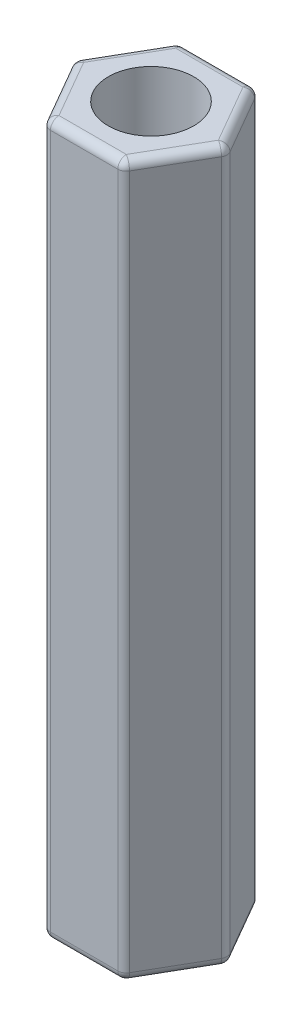
ISO-10303-21;
HEADER;
FILE_DESCRIPTION(('STEP AP214'),'2;1');
FILE_NAME('part.step','',(''),(''),'','','');
FILE_SCHEMA(('AUTOMOTIVE_DESIGN { 1 0 10303 214 1 1 1 1 }'));
ENDSEC;
DATA;
#1=APPLICATION_CONTEXT('core data for automotive mechanical design processes');
#2=APPLICATION_PROTOCOL_DEFINITION('international standard','automotive_design',2000,#1);
#3=PRODUCT_CONTEXT('',#1,'mechanical');
#4=PRODUCT('Part','Part','',(#3));
#5=PRODUCT_RELATED_PRODUCT_CATEGORY('part','',(#4));
#6=PRODUCT_DEFINITION_FORMATION('','',#4);
#7=PRODUCT_DEFINITION_CONTEXT('part definition',#1,'design');
#8=PRODUCT_DEFINITION('design','',#6,#7);
#9=PRODUCT_DEFINITION_SHAPE('','',#8);
#10=(LENGTH_UNIT() NAMED_UNIT(*) SI_UNIT(.MILLI.,.METRE.));
#11=(NAMED_UNIT(*) PLANE_ANGLE_UNIT() SI_UNIT($,.RADIAN.));
#12=(NAMED_UNIT(*) SI_UNIT($,.STERADIAN.) SOLID_ANGLE_UNIT());
#13=UNCERTAINTY_MEASURE_WITH_UNIT(LENGTH_MEASURE(1.E-05),#10,'distance_accuracy_value','');
#14=(GEOMETRIC_REPRESENTATION_CONTEXT(3) GLOBAL_UNCERTAINTY_ASSIGNED_CONTEXT((#13)) GLOBAL_UNIT_ASSIGNED_CONTEXT((#10,
#11,#12)) REPRESENTATION_CONTEXT('',''));
#15=CARTESIAN_POINT('',(0.,0.,0.));
#16=DIRECTION('',(0.,0.,1.));
#17=DIRECTION('',(1.,0.,0.));
#18=AXIS2_PLACEMENT_3D('',#15,#16,#17);
#19=CARTESIAN_POINT('',(0.,25.,0.));
#20=DIRECTION('',(0.,1.,0.));
#21=DIRECTION('',(0.,0.,1.));
#22=AXIS2_PLACEMENT_3D('',#19,#20,#21);
#23=PLANE('',#22);
#24=DIRECTION('',(0.500000000000007,0.,0.866025403784435));
#25=VECTOR('',#24,1.);
#26=CARTESIAN_POINT('',(-1.09696551146027,25.,2.20000000000001));
#27=LINE('',#26,#25);
#28=CARTESIAN_POINT('',(-2.36713610367747,25.,0.));
#29=VERTEX_POINT('',#28);
#30=CARTESIAN_POINT('',(-1.18356805183872,25.,2.05000000000001));
#31=VERTEX_POINT('',#30);
#32=EDGE_CURVE('E255',#29,#31,#27,.T.);
#33=ORIENTED_EDGE('',*,*,#32,.T.);
#34=DIRECTION('',(1.,0.,0.));
#35=VECTOR('',#34,1.);
#36=CARTESIAN_POINT('',(1.35677313259565,25.,2.04999999999999));
#37=LINE('',#36,#35);
#38=CARTESIAN_POINT('',(1.18356805183876,25.,2.04999999999999));
#39=VERTEX_POINT('',#38);
#40=EDGE_CURVE('E257',#31,#39,#37,.T.);
#41=ORIENTED_EDGE('',*,*,#40,.T.);
#42=DIRECTION('',(0.499999999999995,0.,-0.866025403784442));
#43=VECTOR('',#42,1.);
#44=CARTESIAN_POINT('',(2.45373864405591,25.,-0.149999999999998));
#45=LINE('',#44,#43);
#46=CARTESIAN_POINT('',(2.36713610367747,25.,0.));
#47=VERTEX_POINT('',#46);
#48=EDGE_CURVE('E247',#39,#47,#45,.T.);
#49=ORIENTED_EDGE('',*,*,#48,.T.);
#50=DIRECTION('',(-0.500000000000001,0.,-0.866025403784438));
#51=VECTOR('',#50,1.);
#52=CARTESIAN_POINT('',(1.09696551146029,25.,-2.20000000000001));
#53=LINE('',#52,#51);
#54=CARTESIAN_POINT('',(1.18356805183873,25.,-2.05000000000001));
#55=VERTEX_POINT('',#54);
#56=EDGE_CURVE('E249',#47,#55,#53,.T.);
#57=ORIENTED_EDGE('',*,*,#56,.T.);
#58=DIRECTION('',(-1.,0.,0.));
#59=VECTOR('',#58,1.);
#60=CARTESIAN_POINT('',(-1.35677313259563,25.,-2.05));
#61=LINE('',#60,#59);
#62=CARTESIAN_POINT('',(-1.18356805183874,25.,-2.05));
#63=VERTEX_POINT('',#62);
#64=EDGE_CURVE('E251',#55,#63,#61,.T.);
#65=ORIENTED_EDGE('',*,*,#64,.T.);
#66=DIRECTION('',(-0.499999999999995,0.,0.866025403784442));
#67=VECTOR('',#66,1.);
#68=CARTESIAN_POINT('',(-2.45373864405591,25.,0.150000000000017));
#69=LINE('',#68,#67);
#70=EDGE_CURVE('E253',#63,#29,#69,.T.);
#71=ORIENTED_EDGE('',*,*,#70,.T.);
#72=EDGE_LOOP('',(#33,#41,#49,#57,#65,#71));
#73=FACE_BOUND('',#72,.T.);
#74=CARTESIAN_POINT('',(0.,25.,0.));
#75=DIRECTION('',(0.,1.,0.));
#76=DIRECTION('',(0.,0.,1.));
#77=AXIS2_PLACEMENT_3D('',#74,#75,#76);
#78=CIRCLE('',#77,1.5);
#79=CARTESIAN_POINT('',(0.,25.,1.5));
#80=VERTEX_POINT('',#79);
#81=EDGE_CURVE('E194',#80,#80,#78,.T.);
#82=ORIENTED_EDGE('',*,*,#81,.F.);
#83=EDGE_LOOP('',(#82));
#84=FACE_BOUND('',#83,.T.);
#85=ADVANCED_FACE('F37',(#73,#84),#23,.T.);
#86=CARTESIAN_POINT('',(0.,0.,0.));
#87=DIRECTION('',(0.,1.,0.));
#88=DIRECTION('',(0.,0.,1.));
#89=AXIS2_PLACEMENT_3D('',#86,#87,#88);
#90=PLANE('',#89);
#91=DIRECTION('',(0.499999999999995,0.,-0.866025403784442));
#92=VECTOR('',#91,1.);
#93=CARTESIAN_POINT('',(1.77535207775811,0.,1.02499999999999));
#94=LINE('',#93,#92);
#95=CARTESIAN_POINT('',(2.36713610367747,0.,0.));
#96=VERTEX_POINT('',#95);
#97=CARTESIAN_POINT('',(1.18356805183876,0.,2.04999999999999));
#98=VERTEX_POINT('',#97);
#99=EDGE_CURVE('E260',#96,#98,#94,.F.);
#100=ORIENTED_EDGE('',*,*,#99,.T.);
#101=DIRECTION('',(1.,0.,0.));
#102=VECTOR('',#101,1.);
#103=CARTESIAN_POINT('',(0.,0.,2.05));
#104=LINE('',#103,#102);
#105=CARTESIAN_POINT('',(-1.18356805183872,0.,2.05000000000001));
#106=VERTEX_POINT('',#105);
#107=EDGE_CURVE('E11',#98,#106,#104,.F.);
#108=ORIENTED_EDGE('',*,*,#107,.T.);
#109=DIRECTION('',(0.500000000000007,0.,0.866025403784435));
#110=VECTOR('',#109,1.);
#111=CARTESIAN_POINT('',(-1.77535207775809,0.,1.02500000000001));
#112=LINE('',#111,#110);
#113=CARTESIAN_POINT('',(-2.36713610367747,0.,0.));
#114=VERTEX_POINT('',#113);
#115=EDGE_CURVE('E46',#106,#114,#112,.F.);
#116=ORIENTED_EDGE('',*,*,#115,.T.);
#117=DIRECTION('',(-0.499999999999995,0.,0.866025403784442));
#118=VECTOR('',#117,1.);
#119=CARTESIAN_POINT('',(-1.77535207775811,0.,-1.02499999999999));
#120=LINE('',#119,#118);
#121=CARTESIAN_POINT('',(-1.18356805183874,0.,-2.05));
#122=VERTEX_POINT('',#121);
#123=EDGE_CURVE('E266',#114,#122,#120,.F.);
#124=ORIENTED_EDGE('',*,*,#123,.T.);
#125=DIRECTION('',(-1.,0.,0.));
#126=VECTOR('',#125,1.);
#127=CARTESIAN_POINT('',(0.,0.,-2.05));
#128=LINE('',#127,#126);
#129=CARTESIAN_POINT('',(1.18356805183873,0.,-2.05000000000001));
#130=VERTEX_POINT('',#129);
#131=EDGE_CURVE('E264',#122,#130,#128,.F.);
#132=ORIENTED_EDGE('',*,*,#131,.T.);
#133=DIRECTION('',(-0.500000000000001,0.,-0.866025403784438));
#134=VECTOR('',#133,1.);
#135=CARTESIAN_POINT('',(1.7753520777581,0.,-1.025));
#136=LINE('',#135,#134);
#137=EDGE_CURVE('E262',#130,#96,#136,.F.);
#138=ORIENTED_EDGE('',*,*,#137,.T.);
#139=EDGE_LOOP('',(#100,#108,#116,#124,#132,#138));
#140=FACE_BOUND('',#139,.T.);
#141=CARTESIAN_POINT('',(0.,0.,0.));
#142=DIRECTION('',(0.,1.,0.));
#143=DIRECTION('',(0.,0.,1.));
#144=AXIS2_PLACEMENT_3D('',#141,#142,#143);
#145=CIRCLE('',#144,1.5);
#146=CARTESIAN_POINT('',(0.,0.,1.5));
#147=VERTEX_POINT('',#146);
#148=EDGE_CURVE('E358',#147,#147,#145,.T.);
#149=ORIENTED_EDGE('',*,*,#148,.T.);
#150=EDGE_LOOP('',(#149));
#151=FACE_BOUND('',#150,.T.);
#152=ADVANCED_FACE('F375',(#140,#151),#90,.F.);
#153=CARTESIAN_POINT('',(1.35677313259565,25.,2.34999999999999));
#154=DIRECTION('',(-0.866025403784442,0.,-0.499999999999995));
#155=DIRECTION('',(-0.499999999999995,0.,0.866025403784442));
#156=AXIS2_PLACEMENT_3D('',#153,#154,#155);
#157=PLANE('',#156);
#158=DIRECTION('',(0.,-1.,0.));
#159=VECTOR('',#158,1.);
#160=CARTESIAN_POINT('',(2.6269437248128,25.,0.15));
#161=LINE('',#160,#159);
#162=CARTESIAN_POINT('',(2.6269437248128,0.300000000000002,0.15));
#163=VERTEX_POINT('',#162);
#164=CARTESIAN_POINT('',(2.6269437248128,24.7,0.15));
#165=VERTEX_POINT('',#164);
#166=EDGE_CURVE('E171',#163,#165,#161,.F.);
#167=ORIENTED_EDGE('',*,*,#166,.T.);
#168=DIRECTION('',(0.499999999999995,0.,-0.866025403784442));
#169=VECTOR('',#168,1.);
#170=CARTESIAN_POINT('',(1.35677313259565,24.7,2.34999999999999));
#171=LINE('',#170,#169);
#172=CARTESIAN_POINT('',(1.44337567297409,24.7,2.19999999999999));
#173=VERTEX_POINT('',#172);
#174=EDGE_CURVE('E209',#165,#173,#171,.F.);
#175=ORIENTED_EDGE('',*,*,#174,.T.);
#176=DIRECTION('',(0.,-1.,0.));
#177=VECTOR('',#176,1.);
#178=CARTESIAN_POINT('',(1.44337567297409,25.,2.19999999999999));
#179=LINE('',#178,#177);
#180=CARTESIAN_POINT('',(1.44337567297409,0.300000000000002,2.19999999999999));
#181=VERTEX_POINT('',#180);
#182=EDGE_CURVE('E206',#173,#181,#179,.T.);
#183=ORIENTED_EDGE('',*,*,#182,.T.);
#184=DIRECTION('',(0.499999999999995,0.,-0.866025403784442));
#185=VECTOR('',#184,1.);
#186=CARTESIAN_POINT('',(1.35677313259565,0.300000000000002,2.34999999999999));
#187=LINE('',#186,#185);
#188=EDGE_CURVE('E201',#181,#163,#187,.T.);
#189=ORIENTED_EDGE('',*,*,#188,.T.);
#190=EDGE_LOOP('',(#167,#175,#183,#189));
#191=FACE_BOUND('',#190,.T.);
#192=ADVANCED_FACE('F381',(#191),#157,.F.);
#193=CARTESIAN_POINT('',(2.71354626519124,25.,0.));
#194=DIRECTION('',(-0.866025403784438,0.,0.500000000000001));
#195=DIRECTION('',(0.500000000000001,0.,0.866025403784438));
#196=AXIS2_PLACEMENT_3D('',#193,#194,#195);
#197=PLANE('',#196);
#198=DIRECTION('',(0.,-1.,0.));
#199=VECTOR('',#198,1.);
#200=CARTESIAN_POINT('',(1.44337567297406,25.,-2.20000000000001));
#201=LINE('',#200,#199);
#202=CARTESIAN_POINT('',(1.44337567297406,0.300000000000002,-2.20000000000001));
#203=VERTEX_POINT('',#202);
#204=CARTESIAN_POINT('',(1.44337567297406,24.7,-2.20000000000001));
#205=VERTEX_POINT('',#204);
#206=EDGE_CURVE('E193',#203,#205,#201,.F.);
#207=ORIENTED_EDGE('',*,*,#206,.T.);
#208=DIRECTION('',(-0.500000000000001,0.,-0.866025403784438));
#209=VECTOR('',#208,1.);
#210=CARTESIAN_POINT('',(2.71354626519124,24.7,0.));
#211=LINE('',#210,#209);
#212=CARTESIAN_POINT('',(2.6269437248128,24.7,-0.149999999999999));
#213=VERTEX_POINT('',#212);
#214=EDGE_CURVE('E198',#205,#213,#211,.F.);
#215=ORIENTED_EDGE('',*,*,#214,.T.);
#216=DIRECTION('',(0.,-1.,0.));
#217=VECTOR('',#216,1.);
#218=CARTESIAN_POINT('',(2.6269437248128,25.,-0.149999999999999));
#219=LINE('',#218,#217);
#220=CARTESIAN_POINT('',(2.6269437248128,0.300000000000002,-0.149999999999999));
#221=VERTEX_POINT('',#220);
#222=EDGE_CURVE('E169',#213,#221,#219,.T.);
#223=ORIENTED_EDGE('',*,*,#222,.T.);
#224=DIRECTION('',(-0.500000000000001,0.,-0.866025403784438));
#225=VECTOR('',#224,1.);
#226=CARTESIAN_POINT('',(2.71354626519124,0.300000000000002,0.));
#227=LINE('',#226,#225);
#228=EDGE_CURVE('E187',#221,#203,#227,.T.);
#229=ORIENTED_EDGE('',*,*,#228,.T.);
#230=EDGE_LOOP('',(#207,#215,#223,#229));
#231=FACE_BOUND('',#230,.T.);
#232=ADVANCED_FACE('F196',(#231),#197,.F.);
#233=CARTESIAN_POINT('',(1.35677313259562,25.,-2.35000000000001));
#234=DIRECTION('',(0.,0.,1.));
#235=DIRECTION('',(1.,0.,0.));
#236=AXIS2_PLACEMENT_3D('',#233,#234,#235);
#237=PLANE('',#236);
#238=DIRECTION('',(0.,-1.,0.));
#239=VECTOR('',#238,1.);
#240=CARTESIAN_POINT('',(-1.18356805183874,25.,-2.35));
#241=LINE('',#240,#239);
#242=CARTESIAN_POINT('',(-1.18356805183874,0.300000000000002,-2.35));
#243=VERTEX_POINT('',#242);
#244=CARTESIAN_POINT('',(-1.18356805183874,24.7,-2.35));
#245=VERTEX_POINT('',#244);
#246=EDGE_CURVE('E213',#243,#245,#241,.F.);
#247=ORIENTED_EDGE('',*,*,#246,.T.);
#248=DIRECTION('',(-1.,0.,0.));
#249=VECTOR('',#248,1.);
#250=CARTESIAN_POINT('',(1.35677313259562,24.7,-2.35000000000001));
#251=LINE('',#250,#249);
#252=CARTESIAN_POINT('',(1.18356805183873,24.7,-2.35));
#253=VERTEX_POINT('',#252);
#254=EDGE_CURVE('E218',#245,#253,#251,.F.);
#255=ORIENTED_EDGE('',*,*,#254,.T.);
#256=DIRECTION('',(0.,-1.,0.));
#257=VECTOR('',#256,1.);
#258=CARTESIAN_POINT('',(1.18356805183873,25.,-2.35));
#259=LINE('',#258,#257);
#260=CARTESIAN_POINT('',(1.18356805183873,0.300000000000002,-2.35));
#261=VERTEX_POINT('',#260);
#262=EDGE_CURVE('E215',#253,#261,#259,.T.);
#263=ORIENTED_EDGE('',*,*,#262,.T.);
#264=DIRECTION('',(-1.,0.,0.));
#265=VECTOR('',#264,1.);
#266=CARTESIAN_POINT('',(1.35677313259562,0.300000000000002,-2.35000000000001));
#267=LINE('',#266,#265);
#268=EDGE_CURVE('E211',#261,#243,#267,.T.);
#269=ORIENTED_EDGE('',*,*,#268,.T.);
#270=EDGE_LOOP('',(#247,#255,#263,#269));
#271=FACE_BOUND('',#270,.T.);
#272=ADVANCED_FACE('F396',(#271),#237,.F.);
#273=CARTESIAN_POINT('',(-1.35677313259563,25.,-2.35));
#274=DIRECTION('',(0.866025403784442,0.,0.499999999999995));
#275=DIRECTION('',(0.499999999999995,0.,-0.866025403784442));
#276=AXIS2_PLACEMENT_3D('',#273,#274,#275);
#277=PLANE('',#276);
#278=DIRECTION('',(0.,-1.,0.));
#279=VECTOR('',#278,1.);
#280=CARTESIAN_POINT('',(-2.6269437248128,25.,-0.149999999999982));
#281=LINE('',#280,#279);
#282=CARTESIAN_POINT('',(-2.6269437248128,0.300000000000002,-0.149999999999982));
#283=VERTEX_POINT('',#282);
#284=CARTESIAN_POINT('',(-2.6269437248128,24.7,-0.149999999999982));
#285=VERTEX_POINT('',#284);
#286=EDGE_CURVE('E222',#283,#285,#281,.F.);
#287=ORIENTED_EDGE('',*,*,#286,.T.);
#288=DIRECTION('',(-0.499999999999995,0.,0.866025403784442));
#289=VECTOR('',#288,1.);
#290=CARTESIAN_POINT('',(-1.35677313259563,24.7,-2.35));
#291=LINE('',#290,#289);
#292=CARTESIAN_POINT('',(-1.44337567297408,24.7,-2.19999999999999));
#293=VERTEX_POINT('',#292);
#294=EDGE_CURVE('E227',#285,#293,#291,.F.);
#295=ORIENTED_EDGE('',*,*,#294,.T.);
#296=DIRECTION('',(0.,-1.,0.));
#297=VECTOR('',#296,1.);
#298=CARTESIAN_POINT('',(-1.44337567297408,25.,-2.19999999999999));
#299=LINE('',#298,#297);
#300=CARTESIAN_POINT('',(-1.44337567297408,0.300000000000002,-2.19999999999999));
#301=VERTEX_POINT('',#300);
#302=EDGE_CURVE('E224',#293,#301,#299,.T.);
#303=ORIENTED_EDGE('',*,*,#302,.T.);
#304=DIRECTION('',(-0.499999999999995,0.,0.866025403784442));
#305=VECTOR('',#304,1.);
#306=CARTESIAN_POINT('',(-1.35677313259563,0.300000000000002,-2.35));
#307=LINE('',#306,#305);
#308=EDGE_CURVE('E220',#301,#283,#307,.T.);
#309=ORIENTED_EDGE('',*,*,#308,.T.);
#310=EDGE_LOOP('',(#287,#295,#303,#309));
#311=FACE_BOUND('',#310,.T.);
#312=ADVANCED_FACE('F392',(#311),#277,.F.);
#313=CARTESIAN_POINT('',(-2.71354626519124,25.,0.));
#314=DIRECTION('',(0.866025403784435,0.,-0.500000000000007));
#315=DIRECTION('',(-0.500000000000007,0.,-0.866025403784435));
#316=AXIS2_PLACEMENT_3D('',#313,#314,#315);
#317=PLANE('',#316);
#318=DIRECTION('',(0.,-1.,0.));
#319=VECTOR('',#318,1.);
#320=CARTESIAN_POINT('',(-1.44337567297405,25.,2.20000000000001));
#321=LINE('',#320,#319);
#322=CARTESIAN_POINT('',(-1.44337567297405,0.300000000000002,2.20000000000001));
#323=VERTEX_POINT('',#322);
#324=CARTESIAN_POINT('',(-1.44337567297405,24.7,2.20000000000001));
#325=VERTEX_POINT('',#324);
#326=EDGE_CURVE('E231',#323,#325,#321,.F.);
#327=ORIENTED_EDGE('',*,*,#326,.T.);
#328=DIRECTION('',(0.500000000000007,0.,0.866025403784435));
#329=VECTOR('',#328,1.);
#330=CARTESIAN_POINT('',(-2.71354626519124,24.7,0.));
#331=LINE('',#330,#329);
#332=CARTESIAN_POINT('',(-2.6269437248128,24.7,0.150000000000019));
#333=VERTEX_POINT('',#332);
#334=EDGE_CURVE('E236',#325,#333,#331,.F.);
#335=ORIENTED_EDGE('',*,*,#334,.T.);
#336=DIRECTION('',(0.,-1.,0.));
#337=VECTOR('',#336,1.);
#338=CARTESIAN_POINT('',(-2.6269437248128,25.,0.150000000000019));
#339=LINE('',#338,#337);
#340=CARTESIAN_POINT('',(-2.6269437248128,0.300000000000002,0.150000000000019));
#341=VERTEX_POINT('',#340);
#342=EDGE_CURVE('E233',#333,#341,#339,.T.);
#343=ORIENTED_EDGE('',*,*,#342,.T.);
#344=DIRECTION('',(0.500000000000007,0.,0.866025403784435));
#345=VECTOR('',#344,1.);
#346=CARTESIAN_POINT('',(-2.71354626519124,0.300000000000002,0.));
#347=LINE('',#346,#345);
#348=EDGE_CURVE('E229',#341,#323,#347,.T.);
#349=ORIENTED_EDGE('',*,*,#348,.T.);
#350=EDGE_LOOP('',(#327,#335,#343,#349));
#351=FACE_BOUND('',#350,.T.);
#352=ADVANCED_FACE('F388',(#351),#317,.F.);
#353=CARTESIAN_POINT('',(-1.3567731325956,25.,2.35000000000001));
#354=DIRECTION('',(0.,0.,-1.));
#355=DIRECTION('',(-1.,0.,0.));
#356=AXIS2_PLACEMENT_3D('',#353,#354,#355);
#357=PLANE('',#356);
#358=DIRECTION('',(0.,-1.,0.));
#359=VECTOR('',#358,1.);
#360=CARTESIAN_POINT('',(1.18356805183876,25.,2.34999999999999));
#361=LINE('',#360,#359);
#362=CARTESIAN_POINT('',(1.18356805183876,0.300000000000002,2.34999999999999));
#363=VERTEX_POINT('',#362);
#364=CARTESIAN_POINT('',(1.18356805183876,24.7,2.34999999999999));
#365=VERTEX_POINT('',#364);
#366=EDGE_CURVE('E240',#363,#365,#361,.F.);
#367=ORIENTED_EDGE('',*,*,#366,.T.);
#368=DIRECTION('',(1.,0.,0.));
#369=VECTOR('',#368,1.);
#370=CARTESIAN_POINT('',(-1.3567731325956,24.7,2.35000000000001));
#371=LINE('',#370,#369);
#372=CARTESIAN_POINT('',(-1.18356805183871,24.7,2.35000000000001));
#373=VERTEX_POINT('',#372);
#374=EDGE_CURVE('E245',#365,#373,#371,.F.);
#375=ORIENTED_EDGE('',*,*,#374,.T.);
#376=DIRECTION('',(0.,-1.,0.));
#377=VECTOR('',#376,1.);
#378=CARTESIAN_POINT('',(-1.18356805183871,25.,2.35000000000001));
#379=LINE('',#378,#377);
#380=CARTESIAN_POINT('',(-1.18356805183871,0.300000000000002,2.35000000000001));
#381=VERTEX_POINT('',#380);
#382=EDGE_CURVE('E242',#373,#381,#379,.T.);
#383=ORIENTED_EDGE('',*,*,#382,.T.);
#384=DIRECTION('',(1.,0.,0.));
#385=VECTOR('',#384,1.);
#386=CARTESIAN_POINT('',(-1.3567731325956,0.300000000000002,2.35000000000001));
#387=LINE('',#386,#385);
#388=EDGE_CURVE('E238',#381,#363,#387,.T.);
#389=ORIENTED_EDGE('',*,*,#388,.T.);
#390=EDGE_LOOP('',(#367,#375,#383,#389));
#391=FACE_BOUND('',#390,.T.);
#392=ADVANCED_FACE('F385',(#391),#357,.F.);
#393=CARTESIAN_POINT('',(0.,25.,0.));
#394=DIRECTION('',(0.,-1.,0.));
#395=DIRECTION('',(0.,0.,-1.));
#396=AXIS2_PLACEMENT_3D('',#393,#394,#395);
#397=CYLINDRICAL_SURFACE('',#396,1.5);
#398=ORIENTED_EDGE('',*,*,#81,.T.);
#399=EDGE_LOOP('',(#398));
#400=FACE_BOUND('',#399,.T.);
#401=ORIENTED_EDGE('',*,*,#148,.F.);
#402=EDGE_LOOP('',(#401));
#403=FACE_BOUND('',#402,.T.);
#404=ADVANCED_FACE('F371',(#400,#403),#397,.F.);
#405=CARTESIAN_POINT('',(-2.36713610367747,25.,0.));
#406=DIRECTION('',(0.,-1.,0.));
#407=DIRECTION('',(0.,0.,-1.));
#408=AXIS2_PLACEMENT_3D('',#405,#406,#407);
#409=CYLINDRICAL_SURFACE('',#408,0.3);
#410=CARTESIAN_POINT('',(-2.36713610367747,24.7,0.));
#411=DIRECTION('',(0.,1.,0.));
#412=DIRECTION('',(0.,0.,1.));
#413=AXIS2_PLACEMENT_3D('',#410,#411,#412);
#414=CIRCLE('',#413,0.3);
#415=EDGE_CURVE('E41',#285,#333,#414,.T.);
#416=ORIENTED_EDGE('',*,*,#415,.F.);
#417=ORIENTED_EDGE('',*,*,#286,.F.);
#418=CARTESIAN_POINT('',(-2.36713610367747,0.300000000000002,0.));
#419=DIRECTION('',(0.,-1.,0.));
#420=DIRECTION('',(0.,0.,-1.));
#421=AXIS2_PLACEMENT_3D('',#418,#419,#420);
#422=CIRCLE('',#421,0.3);
#423=EDGE_CURVE('E351',#341,#283,#422,.T.);
#424=ORIENTED_EDGE('',*,*,#423,.F.);
#425=ORIENTED_EDGE('',*,*,#342,.F.);
#426=EDGE_LOOP('',(#416,#417,#424,#425));
#427=FACE_BOUND('',#426,.T.);
#428=ADVANCED_FACE('F39',(#427),#409,.T.);
#429=CARTESIAN_POINT('',(-2.36713610367747,24.7,0.));
#430=DIRECTION('',(0.,0.,1.));
#431=DIRECTION('',(1.,0.,0.));
#432=AXIS2_PLACEMENT_3D('',#429,#430,#431);
#433=SPHERICAL_SURFACE('',#432,0.3);
#434=CARTESIAN_POINT('',(-2.36713610367747,24.7,0.));
#435=DIRECTION('',(-0.499999999999995,0.,0.866025403784442));
#436=DIRECTION('',(0.866025403784442,0.,0.499999999999995));
#437=AXIS2_PLACEMENT_3D('',#434,#435,#436);
#438=CIRCLE('',#437,0.3);
#439=EDGE_CURVE('E346',#285,#29,#438,.F.);
#440=ORIENTED_EDGE('',*,*,#439,.F.);
#441=ORIENTED_EDGE('',*,*,#415,.T.);
#442=CARTESIAN_POINT('',(-2.36713610367747,24.7,0.));
#443=DIRECTION('',(-0.500000000000007,0.,-0.866025403784435));
#444=DIRECTION('',(-0.866025403784435,0.,0.500000000000007));
#445=AXIS2_PLACEMENT_3D('',#442,#443,#444);
#446=CIRCLE('',#445,0.3);
#447=EDGE_CURVE('E349',#29,#333,#446,.F.);
#448=ORIENTED_EDGE('',*,*,#447,.F.);
#449=EDGE_LOOP('',(#440,#441,#448));
#450=FACE_BOUND('',#449,.T.);
#451=ADVANCED_FACE('F509',(#450),#433,.T.);
#452=CARTESIAN_POINT('',(-2.36713610367747,0.3,0.));
#453=DIRECTION('',(0.,0.,1.));
#454=DIRECTION('',(1.,0.,0.));
#455=AXIS2_PLACEMENT_3D('',#452,#453,#454);
#456=SPHERICAL_SURFACE('',#455,0.3);
#457=CARTESIAN_POINT('',(-2.36713610367747,0.3,0.));
#458=DIRECTION('',(-0.500000000000006,0.,-0.866025403784435));
#459=DIRECTION('',(-0.866025403784435,0.,0.500000000000006));
#460=AXIS2_PLACEMENT_3D('',#457,#458,#459);
#461=CIRCLE('',#460,0.3);
#462=EDGE_CURVE('E341',#341,#114,#461,.F.);
#463=ORIENTED_EDGE('',*,*,#462,.F.);
#464=ORIENTED_EDGE('',*,*,#423,.T.);
#465=CARTESIAN_POINT('',(-2.36713610367747,0.300000000000002,0.));
#466=DIRECTION('',(-0.499999999999995,0.,0.866025403784442));
#467=DIRECTION('',(0.866025403784442,0.,0.499999999999995));
#468=AXIS2_PLACEMENT_3D('',#465,#466,#467);
#469=CIRCLE('',#468,0.3);
#470=EDGE_CURVE('E343',#114,#283,#469,.F.);
#471=ORIENTED_EDGE('',*,*,#470,.F.);
#472=EDGE_LOOP('',(#463,#464,#471));
#473=FACE_BOUND('',#472,.T.);
#474=ADVANCED_FACE('F506',(#473),#456,.T.);
#475=CARTESIAN_POINT('',(-1.77535207775809,24.7,1.02500000000001));
#476=DIRECTION('',(-0.500000000000007,0.,-0.866025403784435));
#477=DIRECTION('',(-0.866025403784435,0.,0.500000000000007));
#478=AXIS2_PLACEMENT_3D('',#475,#476,#477);
#479=CYLINDRICAL_SURFACE('',#478,0.3);
#480=ORIENTED_EDGE('',*,*,#447,.T.);
#481=ORIENTED_EDGE('',*,*,#334,.F.);
#482=CARTESIAN_POINT('',(-1.18356805183872,24.7,2.05000000000001));
#483=DIRECTION('',(0.500000000000007,0.,0.866025403784434));
#484=DIRECTION('',(0.866025403784435,0.,-0.500000000000007));
#485=AXIS2_PLACEMENT_3D('',#482,#483,#484);
#486=CIRCLE('',#485,0.3);
#487=EDGE_CURVE('E335',#31,#325,#486,.T.);
#488=ORIENTED_EDGE('',*,*,#487,.F.);
#489=ORIENTED_EDGE('',*,*,#32,.F.);
#490=EDGE_LOOP('',(#480,#481,#488,#489));
#491=FACE_BOUND('',#490,.T.);
#492=ADVANCED_FACE('F502',(#491),#479,.T.);
#493=CARTESIAN_POINT('',(-1.77535207775811,24.7,-1.02499999999999));
#494=DIRECTION('',(0.499999999999995,0.,-0.866025403784442));
#495=DIRECTION('',(-0.866025403784442,0.,-0.499999999999995));
#496=AXIS2_PLACEMENT_3D('',#493,#494,#495);
#497=CYLINDRICAL_SURFACE('',#496,0.3);
#498=ORIENTED_EDGE('',*,*,#439,.T.);
#499=ORIENTED_EDGE('',*,*,#70,.F.);
#500=CARTESIAN_POINT('',(-1.18356805183874,24.7,-2.05));
#501=DIRECTION('',(0.499999999999996,0.,-0.866025403784441));
#502=DIRECTION('',(-0.866025403784441,0.,-0.499999999999996));
#503=AXIS2_PLACEMENT_3D('',#500,#501,#502);
#504=CIRCLE('',#503,0.3);
#505=EDGE_CURVE('E332',#293,#63,#504,.T.);
#506=ORIENTED_EDGE('',*,*,#505,.F.);
#507=ORIENTED_EDGE('',*,*,#294,.F.);
#508=EDGE_LOOP('',(#498,#499,#506,#507));
#509=FACE_BOUND('',#508,.T.);
#510=ADVANCED_FACE('F498',(#509),#497,.T.);
#511=CARTESIAN_POINT('',(-1.18356805183874,25.,-2.05));
#512=DIRECTION('',(0.,-1.,0.));
#513=DIRECTION('',(0.,0.,-1.));
#514=AXIS2_PLACEMENT_3D('',#511,#512,#513);
#515=CYLINDRICAL_SURFACE('',#514,0.3);
#516=CARTESIAN_POINT('',(-1.18356805183874,0.300000000000002,-2.05));
#517=DIRECTION('',(0.,-1.,0.));
#518=DIRECTION('',(0.,0.,-1.));
#519=AXIS2_PLACEMENT_3D('',#516,#517,#518);
#520=CIRCLE('',#519,0.3);
#521=EDGE_CURVE('E326',#301,#243,#520,.T.);
#522=ORIENTED_EDGE('',*,*,#521,.F.);
#523=ORIENTED_EDGE('',*,*,#302,.F.);
#524=CARTESIAN_POINT('',(-1.18356805183874,24.7,-2.05));
#525=DIRECTION('',(0.,1.,0.));
#526=DIRECTION('',(0.,0.,1.));
#527=AXIS2_PLACEMENT_3D('',#524,#525,#526);
#528=CIRCLE('',#527,0.3);
#529=EDGE_CURVE('E329',#245,#293,#528,.T.);
#530=ORIENTED_EDGE('',*,*,#529,.F.);
#531=ORIENTED_EDGE('',*,*,#246,.F.);
#532=EDGE_LOOP('',(#522,#523,#530,#531));
#533=FACE_BOUND('',#532,.T.);
#534=ADVANCED_FACE('F494',(#533),#515,.T.);
#535=CARTESIAN_POINT('',(-1.0969655114603,0.300000000000002,-2.2));
#536=DIRECTION('',(-0.499999999999995,0.,0.866025403784442));
#537=DIRECTION('',(0.866025403784442,0.,0.499999999999995));
#538=AXIS2_PLACEMENT_3D('',#535,#536,#537);
#539=CYLINDRICAL_SURFACE('',#538,0.3);
#540=ORIENTED_EDGE('',*,*,#470,.T.);
#541=ORIENTED_EDGE('',*,*,#308,.F.);
#542=CARTESIAN_POINT('',(-1.18356805183874,0.3,-2.05));
#543=DIRECTION('',(0.499999999999995,0.,-0.866025403784441));
#544=DIRECTION('',(-0.866025403784441,0.,-0.499999999999995));
#545=AXIS2_PLACEMENT_3D('',#542,#543,#544);
#546=CIRCLE('',#545,0.3);
#547=EDGE_CURVE('E324',#122,#301,#546,.T.);
#548=ORIENTED_EDGE('',*,*,#547,.F.);
#549=ORIENTED_EDGE('',*,*,#123,.F.);
#550=EDGE_LOOP('',(#540,#541,#548,#549));
#551=FACE_BOUND('',#550,.T.);
#552=ADVANCED_FACE('F490',(#551),#539,.T.);
#553=CARTESIAN_POINT('',(-2.45373864405591,0.300000000000002,-0.149999999999983));
#554=DIRECTION('',(0.500000000000007,0.,0.866025403784435));
#555=DIRECTION('',(0.866025403784435,0.,-0.500000000000007));
#556=AXIS2_PLACEMENT_3D('',#553,#554,#555);
#557=CYLINDRICAL_SURFACE('',#556,0.3);
#558=ORIENTED_EDGE('',*,*,#462,.T.);
#559=ORIENTED_EDGE('',*,*,#115,.F.);
#560=CARTESIAN_POINT('',(-1.18356805183871,0.300000000000002,2.05000000000001));
#561=DIRECTION('',(0.500000000000007,0.,0.866025403784435));
#562=DIRECTION('',(0.866025403784435,0.,-0.500000000000007));
#563=AXIS2_PLACEMENT_3D('',#560,#561,#562);
#564=CIRCLE('',#563,0.3);
#565=EDGE_CURVE('E322',#323,#106,#564,.T.);
#566=ORIENTED_EDGE('',*,*,#565,.F.);
#567=ORIENTED_EDGE('',*,*,#348,.F.);
#568=EDGE_LOOP('',(#558,#559,#566,#567));
#569=FACE_BOUND('',#568,.T.);
#570=ADVANCED_FACE('F486',(#569),#557,.T.);
#571=CARTESIAN_POINT('',(-1.18356805183872,25.,2.05000000000001));
#572=DIRECTION('',(0.,-1.,0.));
#573=DIRECTION('',(0.,0.,-1.));
#574=AXIS2_PLACEMENT_3D('',#571,#572,#573);
#575=CYLINDRICAL_SURFACE('',#574,0.3);
#576=CARTESIAN_POINT('',(-1.18356805183871,24.7,2.05000000000001));
#577=DIRECTION('',(0.,1.,0.));
#578=DIRECTION('',(0.,0.,1.));
#579=AXIS2_PLACEMENT_3D('',#576,#577,#578);
#580=CIRCLE('',#579,0.3);
#581=EDGE_CURVE('E338',#325,#373,#580,.T.);
#582=ORIENTED_EDGE('',*,*,#581,.F.);
#583=ORIENTED_EDGE('',*,*,#326,.F.);
#584=CARTESIAN_POINT('',(-1.18356805183872,0.300000000000002,2.05000000000001));
#585=DIRECTION('',(0.,-1.,0.));
#586=DIRECTION('',(0.,0.,-1.));
#587=AXIS2_PLACEMENT_3D('',#584,#585,#586);
#588=CIRCLE('',#587,0.3);
#589=EDGE_CURVE('E319',#381,#323,#588,.T.);
#590=ORIENTED_EDGE('',*,*,#589,.F.);
#591=ORIENTED_EDGE('',*,*,#382,.F.);
#592=EDGE_LOOP('',(#582,#583,#590,#591));
#593=FACE_BOUND('',#592,.T.);
#594=ADVANCED_FACE('F482',(#593),#575,.T.);
#595=CARTESIAN_POINT('',(-1.18356805183872,24.7,2.05000000000001));
#596=DIRECTION('',(0.,0.,1.));
#597=DIRECTION('',(1.,0.,0.));
#598=AXIS2_PLACEMENT_3D('',#595,#596,#597);
#599=SPHERICAL_SURFACE('',#598,0.3);
#600=ORIENTED_EDGE('',*,*,#487,.T.);
#601=ORIENTED_EDGE('',*,*,#581,.T.);
#602=CARTESIAN_POINT('',(-1.18356805183872,24.7,2.05000000000001));
#603=DIRECTION('',(-1.,0.,0.));
#604=DIRECTION('',(0.,0.,1.));
#605=AXIS2_PLACEMENT_3D('',#602,#603,#604);
#606=CIRCLE('',#605,0.3);
#607=EDGE_CURVE('E316',#31,#373,#606,.F.);
#608=ORIENTED_EDGE('',*,*,#607,.F.);
#609=EDGE_LOOP('',(#600,#601,#608));
#610=FACE_BOUND('',#609,.T.);
#611=ADVANCED_FACE('F478',(#610),#599,.T.);
#612=CARTESIAN_POINT('',(-1.18356805183874,24.7,-2.05));
#613=DIRECTION('',(0.,0.,1.));
#614=DIRECTION('',(1.,0.,0.));
#615=AXIS2_PLACEMENT_3D('',#612,#613,#614);
#616=SPHERICAL_SURFACE('',#615,0.3);
#617=ORIENTED_EDGE('',*,*,#529,.T.);
#618=ORIENTED_EDGE('',*,*,#505,.T.);
#619=CARTESIAN_POINT('',(-1.18356805183874,24.7,-2.05));
#620=DIRECTION('',(-1.,0.,0.));
#621=DIRECTION('',(0.,0.,1.));
#622=AXIS2_PLACEMENT_3D('',#619,#620,#621);
#623=CIRCLE('',#622,0.3);
#624=EDGE_CURVE('E313',#245,#63,#623,.F.);
#625=ORIENTED_EDGE('',*,*,#624,.F.);
#626=EDGE_LOOP('',(#617,#618,#625));
#627=FACE_BOUND('',#626,.T.);
#628=ADVANCED_FACE('F474',(#627),#616,.T.);
#629=CARTESIAN_POINT('',(-1.18356805183874,0.3,-2.05));
#630=DIRECTION('',(0.,0.,1.));
#631=DIRECTION('',(1.,0.,0.));
#632=AXIS2_PLACEMENT_3D('',#629,#630,#631);
#633=SPHERICAL_SURFACE('',#632,0.3);
#634=ORIENTED_EDGE('',*,*,#547,.T.);
#635=ORIENTED_EDGE('',*,*,#521,.T.);
#636=CARTESIAN_POINT('',(-1.18356805183874,0.300000000000002,-2.05));
#637=DIRECTION('',(-1.,0.,0.));
#638=DIRECTION('',(0.,0.,1.));
#639=AXIS2_PLACEMENT_3D('',#636,#637,#638);
#640=CIRCLE('',#639,0.3);
#641=EDGE_CURVE('E310',#122,#243,#640,.F.);
#642=ORIENTED_EDGE('',*,*,#641,.F.);
#643=EDGE_LOOP('',(#634,#635,#642));
#644=FACE_BOUND('',#643,.T.);
#645=ADVANCED_FACE('F470',(#644),#633,.T.);
#646=CARTESIAN_POINT('',(-1.18356805183872,0.3,2.05000000000001));
#647=DIRECTION('',(0.,0.,1.));
#648=DIRECTION('',(1.,0.,0.));
#649=AXIS2_PLACEMENT_3D('',#646,#647,#648);
#650=SPHERICAL_SURFACE('',#649,0.3);
#651=ORIENTED_EDGE('',*,*,#589,.T.);
#652=ORIENTED_EDGE('',*,*,#565,.T.);
#653=CARTESIAN_POINT('',(-1.18356805183872,0.3,2.05000000000001));
#654=DIRECTION('',(-1.,0.,0.));
#655=DIRECTION('',(0.,0.,1.));
#656=AXIS2_PLACEMENT_3D('',#653,#654,#655);
#657=CIRCLE('',#656,0.3);
#658=EDGE_CURVE('E54',#381,#106,#657,.F.);
#659=ORIENTED_EDGE('',*,*,#658,.F.);
#660=EDGE_LOOP('',(#651,#652,#659));
#661=FACE_BOUND('',#660,.T.);
#662=ADVANCED_FACE('F466',(#661),#650,.T.);
#663=CARTESIAN_POINT('',(0.,24.7,2.05));
#664=DIRECTION('',(-1.,0.,0.));
#665=DIRECTION('',(0.,0.,1.));
#666=AXIS2_PLACEMENT_3D('',#663,#664,#665);
#667=CYLINDRICAL_SURFACE('',#666,0.3);
#668=ORIENTED_EDGE('',*,*,#607,.T.);
#669=ORIENTED_EDGE('',*,*,#374,.F.);
#670=CARTESIAN_POINT('',(1.18356805183876,24.7,2.04999999999999));
#671=DIRECTION('',(1.,0.,0.));
#672=DIRECTION('',(0.,0.,-1.));
#673=AXIS2_PLACEMENT_3D('',#670,#671,#672);
#674=CIRCLE('',#673,0.3);
#675=EDGE_CURVE('E303',#39,#365,#674,.T.);
#676=ORIENTED_EDGE('',*,*,#675,.F.);
#677=ORIENTED_EDGE('',*,*,#40,.F.);
#678=EDGE_LOOP('',(#668,#669,#676,#677));
#679=FACE_BOUND('',#678,.T.);
#680=ADVANCED_FACE('F462',(#679),#667,.T.);
#681=CARTESIAN_POINT('',(0.,24.7,-2.05));
#682=DIRECTION('',(1.,0.,0.));
#683=DIRECTION('',(0.,0.,-1.));
#684=AXIS2_PLACEMENT_3D('',#681,#682,#683);
#685=CYLINDRICAL_SURFACE('',#684,0.3);
#686=ORIENTED_EDGE('',*,*,#624,.T.);
#687=ORIENTED_EDGE('',*,*,#64,.F.);
#688=CARTESIAN_POINT('',(1.18356805183873,24.7,-2.05000000000001));
#689=DIRECTION('',(1.,0.,0.));
#690=DIRECTION('',(0.,0.,-1.));
#691=AXIS2_PLACEMENT_3D('',#688,#689,#690);
#692=CIRCLE('',#691,0.3);
#693=EDGE_CURVE('E300',#253,#55,#692,.T.);
#694=ORIENTED_EDGE('',*,*,#693,.F.);
#695=ORIENTED_EDGE('',*,*,#254,.F.);
#696=EDGE_LOOP('',(#686,#687,#694,#695));
#697=FACE_BOUND('',#696,.T.);
#698=ADVANCED_FACE('F458',(#697),#685,.T.);
#699=CARTESIAN_POINT('',(1.18356805183873,25.,-2.05000000000001));
#700=DIRECTION('',(0.,-1.,0.));
#701=DIRECTION('',(0.,0.,-1.));
#702=AXIS2_PLACEMENT_3D('',#699,#700,#701);
#703=CYLINDRICAL_SURFACE('',#702,0.3);
#704=CARTESIAN_POINT('',(1.18356805183873,0.300000000000002,-2.05000000000001));
#705=DIRECTION('',(0.,-1.,0.));
#706=DIRECTION('',(0.,0.,-1.));
#707=AXIS2_PLACEMENT_3D('',#704,#705,#706);
#708=CIRCLE('',#707,0.3);
#709=EDGE_CURVE('E294',#261,#203,#708,.T.);
#710=ORIENTED_EDGE('',*,*,#709,.F.);
#711=ORIENTED_EDGE('',*,*,#262,.F.);
#712=CARTESIAN_POINT('',(1.18356805183873,24.7,-2.05000000000001));
#713=DIRECTION('',(0.,1.,0.));
#714=DIRECTION('',(0.,0.,1.));
#715=AXIS2_PLACEMENT_3D('',#712,#713,#714);
#716=CIRCLE('',#715,0.3);
#717=EDGE_CURVE('E297',#205,#253,#716,.T.);
#718=ORIENTED_EDGE('',*,*,#717,.F.);
#719=ORIENTED_EDGE('',*,*,#206,.F.);
#720=EDGE_LOOP('',(#710,#711,#718,#719));
#721=FACE_BOUND('',#720,.T.);
#722=ADVANCED_FACE('F454',(#721),#703,.T.);
#723=CARTESIAN_POINT('',(1.35677313259562,0.300000000000002,-2.05000000000001));
#724=DIRECTION('',(-1.,0.,0.));
#725=DIRECTION('',(0.,0.,1.));
#726=AXIS2_PLACEMENT_3D('',#723,#724,#725);
#727=CYLINDRICAL_SURFACE('',#726,0.3);
#728=ORIENTED_EDGE('',*,*,#641,.T.);
#729=ORIENTED_EDGE('',*,*,#268,.F.);
#730=CARTESIAN_POINT('',(1.18356805183873,0.3,-2.05000000000001));
#731=DIRECTION('',(1.,0.,0.));
#732=DIRECTION('',(0.,0.,-1.));
#733=AXIS2_PLACEMENT_3D('',#730,#731,#732);
#734=CIRCLE('',#733,0.3);
#735=EDGE_CURVE('E292',#130,#261,#734,.T.);
#736=ORIENTED_EDGE('',*,*,#735,.F.);
#737=ORIENTED_EDGE('',*,*,#131,.F.);
#738=EDGE_LOOP('',(#728,#729,#736,#737));
#739=FACE_BOUND('',#738,.T.);
#740=ADVANCED_FACE('F451',(#739),#727,.T.);
#741=CARTESIAN_POINT('',(-1.3567731325956,0.300000000000002,2.05000000000001));
#742=DIRECTION('',(1.,0.,0.));
#743=DIRECTION('',(0.,0.,-1.));
#744=AXIS2_PLACEMENT_3D('',#741,#742,#743);
#745=CYLINDRICAL_SURFACE('',#744,0.3);
#746=ORIENTED_EDGE('',*,*,#658,.T.);
#747=ORIENTED_EDGE('',*,*,#107,.F.);
#748=CARTESIAN_POINT('',(1.18356805183876,0.300000000000002,2.04999999999999));
#749=DIRECTION('',(1.,0.,0.));
#750=DIRECTION('',(0.,0.,-1.));
#751=AXIS2_PLACEMENT_3D('',#748,#749,#750);
#752=CIRCLE('',#751,0.3);
#753=EDGE_CURVE('E289',#363,#98,#752,.T.);
#754=ORIENTED_EDGE('',*,*,#753,.F.);
#755=ORIENTED_EDGE('',*,*,#388,.F.);
#756=EDGE_LOOP('',(#746,#747,#754,#755));
#757=FACE_BOUND('',#756,.T.);
#758=ADVANCED_FACE('F447',(#757),#745,.T.);
#759=CARTESIAN_POINT('',(1.18356805183876,25.,2.04999999999999));
#760=DIRECTION('',(0.,-1.,0.));
#761=DIRECTION('',(0.,0.,-1.));
#762=AXIS2_PLACEMENT_3D('',#759,#760,#761);
#763=CYLINDRICAL_SURFACE('',#762,0.3);
#764=CARTESIAN_POINT('',(1.18356805183876,24.7,2.04999999999999));
#765=DIRECTION('',(0.,1.,0.));
#766=DIRECTION('',(0.,0.,1.));
#767=AXIS2_PLACEMENT_3D('',#764,#765,#766);
#768=CIRCLE('',#767,0.3);
#769=EDGE_CURVE('E306',#365,#173,#768,.T.);
#770=ORIENTED_EDGE('',*,*,#769,.F.);
#771=ORIENTED_EDGE('',*,*,#366,.F.);
#772=CARTESIAN_POINT('',(1.18356805183876,0.300000000000002,2.04999999999999));
#773=DIRECTION('',(0.,-1.,0.));
#774=DIRECTION('',(0.,0.,-1.));
#775=AXIS2_PLACEMENT_3D('',#772,#773,#774);
#776=CIRCLE('',#775,0.3);
#777=EDGE_CURVE('E286',#181,#363,#776,.T.);
#778=ORIENTED_EDGE('',*,*,#777,.F.);
#779=ORIENTED_EDGE('',*,*,#182,.F.);
#780=EDGE_LOOP('',(#770,#771,#778,#779));
#781=FACE_BOUND('',#780,.T.);
#782=ADVANCED_FACE('F443',(#781),#763,.T.);
#783=CARTESIAN_POINT('',(1.18356805183876,24.7,2.04999999999999));
#784=DIRECTION('',(0.,0.,1.));
#785=DIRECTION('',(1.,0.,0.));
#786=AXIS2_PLACEMENT_3D('',#783,#784,#785);
#787=SPHERICAL_SURFACE('',#786,0.3);
#788=ORIENTED_EDGE('',*,*,#675,.T.);
#789=ORIENTED_EDGE('',*,*,#769,.T.);
#790=CARTESIAN_POINT('',(1.18356805183876,24.7,2.04999999999999));
#791=DIRECTION('',(-0.499999999999995,0.,0.866025403784442));
#792=DIRECTION('',(0.866025403784442,0.,0.499999999999995));
#793=AXIS2_PLACEMENT_3D('',#790,#791,#792);
#794=CIRCLE('',#793,0.3);
#795=EDGE_CURVE('E283',#39,#173,#794,.F.);
#796=ORIENTED_EDGE('',*,*,#795,.F.);
#797=EDGE_LOOP('',(#788,#789,#796));
#798=FACE_BOUND('',#797,.T.);
#799=ADVANCED_FACE('F439',(#798),#787,.T.);
#800=CARTESIAN_POINT('',(1.18356805183873,24.7,-2.05000000000001));
#801=DIRECTION('',(0.,0.,1.));
#802=DIRECTION('',(1.,0.,0.));
#803=AXIS2_PLACEMENT_3D('',#800,#801,#802);
#804=SPHERICAL_SURFACE('',#803,0.3);
#805=ORIENTED_EDGE('',*,*,#717,.T.);
#806=ORIENTED_EDGE('',*,*,#693,.T.);
#807=CARTESIAN_POINT('',(1.18356805183873,24.7,-2.05000000000001));
#808=DIRECTION('',(-0.500000000000001,0.,-0.866025403784438));
#809=DIRECTION('',(-0.866025403784438,0.,0.500000000000001));
#810=AXIS2_PLACEMENT_3D('',#807,#808,#809);
#811=CIRCLE('',#810,0.3);
#812=EDGE_CURVE('E280',#205,#55,#811,.F.);
#813=ORIENTED_EDGE('',*,*,#812,.F.);
#814=EDGE_LOOP('',(#805,#806,#813));
#815=FACE_BOUND('',#814,.T.);
#816=ADVANCED_FACE('F435',(#815),#804,.T.);
#817=CARTESIAN_POINT('',(1.18356805183873,0.3,-2.05000000000001));
#818=DIRECTION('',(0.,0.,1.));
#819=DIRECTION('',(1.,0.,0.));
#820=AXIS2_PLACEMENT_3D('',#817,#818,#819);
#821=SPHERICAL_SURFACE('',#820,0.3);
#822=ORIENTED_EDGE('',*,*,#735,.T.);
#823=ORIENTED_EDGE('',*,*,#709,.T.);
#824=CARTESIAN_POINT('',(1.18356805183873,0.300000000000002,-2.05000000000001));
#825=DIRECTION('',(-0.500000000000001,0.,-0.866025403784438));
#826=DIRECTION('',(-0.866025403784438,0.,0.500000000000001));
#827=AXIS2_PLACEMENT_3D('',#824,#825,#826);
#828=CIRCLE('',#827,0.3);
#829=EDGE_CURVE('E190',#130,#203,#828,.F.);
#830=ORIENTED_EDGE('',*,*,#829,.F.);
#831=EDGE_LOOP('',(#822,#823,#830));
#832=FACE_BOUND('',#831,.T.);
#833=ADVANCED_FACE('F431',(#832),#821,.T.);
#834=CARTESIAN_POINT('',(1.18356805183876,0.3,2.04999999999999));
#835=DIRECTION('',(0.,0.,1.));
#836=DIRECTION('',(1.,0.,0.));
#837=AXIS2_PLACEMENT_3D('',#834,#835,#836);
#838=SPHERICAL_SURFACE('',#837,0.3);
#839=ORIENTED_EDGE('',*,*,#777,.T.);
#840=ORIENTED_EDGE('',*,*,#753,.T.);
#841=CARTESIAN_POINT('',(1.18356805183876,0.3,2.04999999999999));
#842=DIRECTION('',(-0.499999999999995,0.,0.866025403784441));
#843=DIRECTION('',(0.866025403784441,0.,0.499999999999995));
#844=AXIS2_PLACEMENT_3D('',#841,#842,#843);
#845=CIRCLE('',#844,0.3);
#846=EDGE_CURVE('E276',#181,#98,#845,.F.);
#847=ORIENTED_EDGE('',*,*,#846,.F.);
#848=EDGE_LOOP('',(#839,#840,#847));
#849=FACE_BOUND('',#848,.T.);
#850=ADVANCED_FACE('F427',(#849),#838,.T.);
#851=CARTESIAN_POINT('',(1.77535207775811,24.7,1.02499999999999));
#852=DIRECTION('',(-0.499999999999995,0.,0.866025403784442));
#853=DIRECTION('',(0.866025403784442,0.,0.499999999999995));
#854=AXIS2_PLACEMENT_3D('',#851,#852,#853);
#855=CYLINDRICAL_SURFACE('',#854,0.3);
#856=ORIENTED_EDGE('',*,*,#795,.T.);
#857=ORIENTED_EDGE('',*,*,#174,.F.);
#858=CARTESIAN_POINT('',(2.36713610367747,24.7,0.));
#859=DIRECTION('',(0.499999999999995,0.,-0.866025403784441));
#860=DIRECTION('',(-0.866025403784441,0.,-0.499999999999995));
#861=AXIS2_PLACEMENT_3D('',#858,#859,#860);
#862=CIRCLE('',#861,0.3);
#863=EDGE_CURVE('E273',#47,#165,#862,.T.);
#864=ORIENTED_EDGE('',*,*,#863,.F.);
#865=ORIENTED_EDGE('',*,*,#48,.F.);
#866=EDGE_LOOP('',(#856,#857,#864,#865));
#867=FACE_BOUND('',#866,.T.);
#868=ADVANCED_FACE('F423',(#867),#855,.T.);
#869=CARTESIAN_POINT('',(1.7753520777581,24.7,-1.025));
#870=DIRECTION('',(0.500000000000001,0.,0.866025403784438));
#871=DIRECTION('',(0.866025403784438,0.,-0.500000000000001));
#872=AXIS2_PLACEMENT_3D('',#869,#870,#871);
#873=CYLINDRICAL_SURFACE('',#872,0.3);
#874=ORIENTED_EDGE('',*,*,#812,.T.);
#875=ORIENTED_EDGE('',*,*,#56,.F.);
#876=CARTESIAN_POINT('',(2.36713610367747,24.7,0.));
#877=DIRECTION('',(0.500000000000001,0.,0.866025403784438));
#878=DIRECTION('',(0.866025403784438,0.,-0.500000000000001));
#879=AXIS2_PLACEMENT_3D('',#876,#877,#878);
#880=CIRCLE('',#879,0.3);
#881=EDGE_CURVE('E184',#213,#47,#880,.T.);
#882=ORIENTED_EDGE('',*,*,#881,.F.);
#883=ORIENTED_EDGE('',*,*,#214,.F.);
#884=EDGE_LOOP('',(#874,#875,#882,#883));
#885=FACE_BOUND('',#884,.T.);
#886=ADVANCED_FACE('F420',(#885),#873,.T.);
#887=CARTESIAN_POINT('',(2.45373864405591,0.300000000000002,0.15));
#888=DIRECTION('',(-0.500000000000001,0.,-0.866025403784438));
#889=DIRECTION('',(-0.866025403784438,0.,0.500000000000001));
#890=AXIS2_PLACEMENT_3D('',#887,#888,#889);
#891=CYLINDRICAL_SURFACE('',#890,0.3);
#892=ORIENTED_EDGE('',*,*,#829,.T.);
#893=ORIENTED_EDGE('',*,*,#228,.F.);
#894=CARTESIAN_POINT('',(2.36713610367747,0.3,0.));
#895=DIRECTION('',(0.5,0.,0.866025403784438));
#896=DIRECTION('',(0.866025403784438,0.,-0.500000000000001));
#897=AXIS2_PLACEMENT_3D('',#894,#895,#896);
#898=CIRCLE('',#897,0.3);
#899=EDGE_CURVE('E177',#96,#221,#898,.T.);
#900=ORIENTED_EDGE('',*,*,#899,.F.);
#901=ORIENTED_EDGE('',*,*,#137,.F.);
#902=EDGE_LOOP('',(#892,#893,#900,#901));
#903=FACE_BOUND('',#902,.T.);
#904=ADVANCED_FACE('F188',(#903),#891,.T.);
#905=CARTESIAN_POINT('',(1.09696551146032,0.300000000000002,2.19999999999999));
#906=DIRECTION('',(0.499999999999995,0.,-0.866025403784442));
#907=DIRECTION('',(-0.866025403784442,0.,-0.499999999999995));
#908=AXIS2_PLACEMENT_3D('',#905,#906,#907);
#909=CYLINDRICAL_SURFACE('',#908,0.3);
#910=ORIENTED_EDGE('',*,*,#846,.T.);
#911=ORIENTED_EDGE('',*,*,#99,.F.);
#912=CARTESIAN_POINT('',(2.36713610367747,0.300000000000002,0.));
#913=DIRECTION('',(0.499999999999995,0.,-0.866025403784442));
#914=DIRECTION('',(-0.866025403784442,0.,-0.499999999999995));
#915=AXIS2_PLACEMENT_3D('',#912,#913,#914);
#916=CIRCLE('',#915,0.3);
#917=EDGE_CURVE('E181',#163,#96,#916,.T.);
#918=ORIENTED_EDGE('',*,*,#917,.F.);
#919=ORIENTED_EDGE('',*,*,#188,.F.);
#920=EDGE_LOOP('',(#910,#911,#918,#919));
#921=FACE_BOUND('',#920,.T.);
#922=ADVANCED_FACE('F413',(#921),#909,.T.);
#923=CARTESIAN_POINT('',(2.36713610367747,24.7,0.));
#924=DIRECTION('',(0.,0.,1.));
#925=DIRECTION('',(1.,0.,0.));
#926=AXIS2_PLACEMENT_3D('',#923,#924,#925);
#927=SPHERICAL_SURFACE('',#926,0.3);
#928=ORIENTED_EDGE('',*,*,#881,.T.);
#929=ORIENTED_EDGE('',*,*,#863,.T.);
#930=CARTESIAN_POINT('',(2.36713610367747,24.7,0.));
#931=DIRECTION('',(0.,1.,0.));
#932=DIRECTION('',(0.,0.,1.));
#933=AXIS2_PLACEMENT_3D('',#930,#931,#932);
#934=CIRCLE('',#933,0.3);
#935=EDGE_CURVE('E174',#213,#165,#934,.F.);
#936=ORIENTED_EDGE('',*,*,#935,.F.);
#937=EDGE_LOOP('',(#928,#929,#936));
#938=FACE_BOUND('',#937,.T.);
#939=ADVANCED_FACE('F410',(#938),#927,.T.);
#940=CARTESIAN_POINT('',(2.36713610367747,0.3,0.));
#941=DIRECTION('',(0.,0.,1.));
#942=DIRECTION('',(1.,0.,0.));
#943=AXIS2_PLACEMENT_3D('',#940,#941,#942);
#944=SPHERICAL_SURFACE('',#943,0.3);
#945=ORIENTED_EDGE('',*,*,#917,.T.);
#946=ORIENTED_EDGE('',*,*,#899,.T.);
#947=CARTESIAN_POINT('',(2.36713610367747,0.300000000000002,0.));
#948=DIRECTION('',(0.,-1.,0.));
#949=DIRECTION('',(0.,0.,-1.));
#950=AXIS2_PLACEMENT_3D('',#947,#948,#949);
#951=CIRCLE('',#950,0.3);
#952=EDGE_CURVE('E165',#163,#221,#951,.F.);
#953=ORIENTED_EDGE('',*,*,#952,.F.);
#954=EDGE_LOOP('',(#945,#946,#953));
#955=FACE_BOUND('',#954,.T.);
#956=ADVANCED_FACE('F179',(#955),#944,.T.);
#957=CARTESIAN_POINT('',(2.36713610367747,25.,0.));
#958=DIRECTION('',(0.,-1.,0.));
#959=DIRECTION('',(0.,0.,-1.));
#960=AXIS2_PLACEMENT_3D('',#957,#958,#959);
#961=CYLINDRICAL_SURFACE('',#960,0.3);
#962=ORIENTED_EDGE('',*,*,#935,.T.);
#963=ORIENTED_EDGE('',*,*,#166,.F.);
#964=ORIENTED_EDGE('',*,*,#952,.T.);
#965=ORIENTED_EDGE('',*,*,#222,.F.);
#966=EDGE_LOOP('',(#962,#963,#964,#965));
#967=FACE_BOUND('',#966,.T.);
#968=ADVANCED_FACE('F167',(#967),#961,.T.);
#969=CLOSED_SHELL('',(#85,#152,#192,#232,#272,#312,#352,#392,#404,#428,#451,#474,#492,#510,#534,
#552,#570,#594,#611,#628,#645,#662,#680,#698,#722,#740,#758,#782,#799,#816,#833,#850,#868,#886,
#904,#922,#939,#956,#968));
#970=MANIFOLD_SOLID_BREP('B2',#969);
#971=ADVANCED_BREP_SHAPE_REPRESENTATION('',(#18,#970),#14);
#972=SHAPE_DEFINITION_REPRESENTATION(#9,#971);
ENDSEC;
END-ISO-10303-21;
